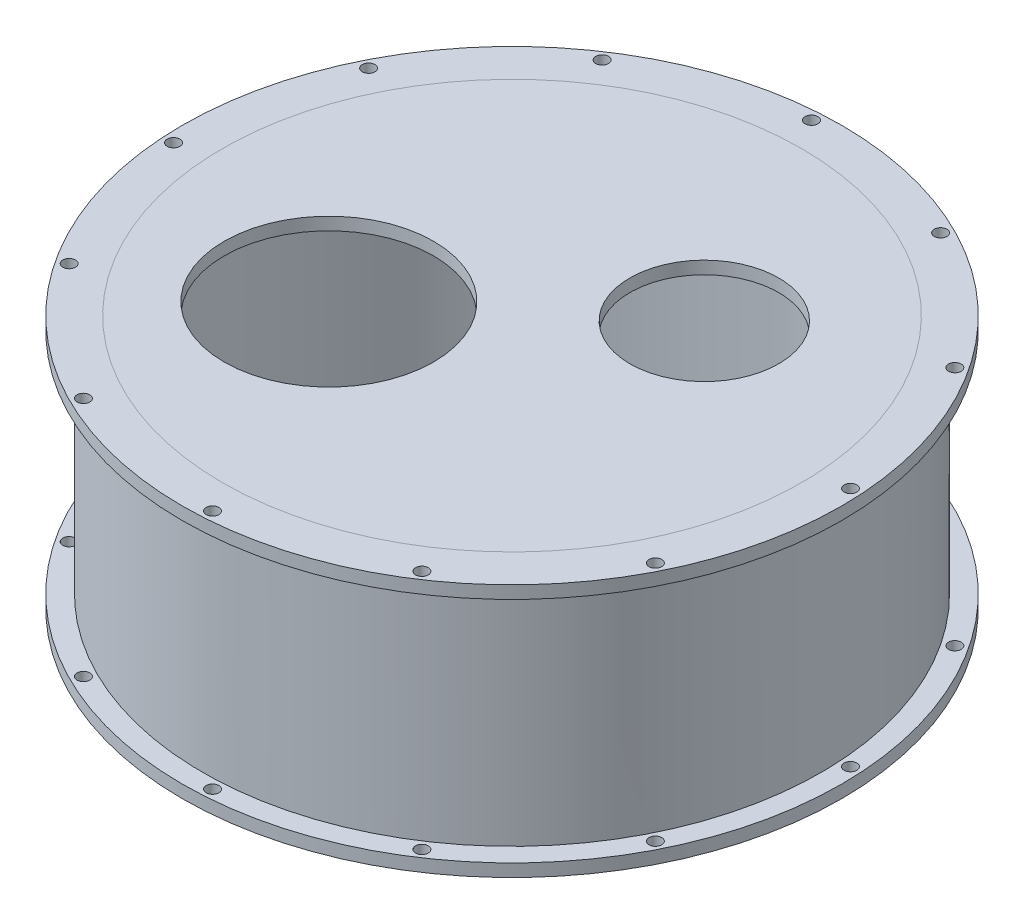
ISO-10303-21;
HEADER;
FILE_DESCRIPTION(('STEP AP214'),'2;1');
FILE_NAME('part.step','',(''),(''),'','','');
FILE_SCHEMA(('AUTOMOTIVE_DESIGN { 1 0 10303 214 1 1 1 1 }'));
ENDSEC;
DATA;
#1=APPLICATION_CONTEXT('core data for automotive mechanical design processes');
#2=APPLICATION_PROTOCOL_DEFINITION('international standard','automotive_design',2000,#1);
#3=PRODUCT_CONTEXT('',#1,'mechanical');
#4=PRODUCT('Part','Part','',(#3));
#5=PRODUCT_RELATED_PRODUCT_CATEGORY('part','',(#4));
#6=PRODUCT_DEFINITION_FORMATION('','',#4);
#7=PRODUCT_DEFINITION_CONTEXT('part definition',#1,'design');
#8=PRODUCT_DEFINITION('design','',#6,#7);
#9=PRODUCT_DEFINITION_SHAPE('','',#8);
#10=(LENGTH_UNIT() NAMED_UNIT(*) SI_UNIT(.MILLI.,.METRE.));
#11=(NAMED_UNIT(*) PLANE_ANGLE_UNIT() SI_UNIT($,.RADIAN.));
#12=(NAMED_UNIT(*) SI_UNIT($,.STERADIAN.) SOLID_ANGLE_UNIT());
#13=UNCERTAINTY_MEASURE_WITH_UNIT(LENGTH_MEASURE(1.E-05),#10,'distance_accuracy_value','');
#14=(GEOMETRIC_REPRESENTATION_CONTEXT(3) GLOBAL_UNCERTAINTY_ASSIGNED_CONTEXT((#13)) GLOBAL_UNIT_ASSIGNED_CONTEXT((#10,
#11,#12)) REPRESENTATION_CONTEXT('',''));
#15=CARTESIAN_POINT('',(0.,0.,0.));
#16=DIRECTION('',(0.,0.,1.));
#17=DIRECTION('',(1.,0.,0.));
#18=AXIS2_PLACEMENT_3D('',#15,#16,#17);
#19=CARTESIAN_POINT('',(0.,120.65,0.));
#20=DIRECTION('',(0.,1.,0.));
#21=DIRECTION('',(0.,0.,1.));
#22=AXIS2_PLACEMENT_3D('',#19,#20,#21);
#23=CYLINDRICAL_SURFACE('',#22,145.);
#24=CARTESIAN_POINT('',(0.,120.65,0.));
#25=DIRECTION('',(0.,1.,0.));
#26=DIRECTION('',(0.,0.,1.));
#27=AXIS2_PLACEMENT_3D('',#24,#25,#26);
#28=CIRCLE('',#27,145.);
#29=CARTESIAN_POINT('',(0.,120.65,145.));
#30=VERTEX_POINT('',#29);
#31=EDGE_CURVE('E12',#30,#30,#28,.T.);
#32=ORIENTED_EDGE('',*,*,#31,.T.);
#33=EDGE_LOOP('',(#32));
#34=FACE_BOUND('',#33,.T.);
#35=CARTESIAN_POINT('',(0.,127.,0.));
#36=DIRECTION('',(0.,1.,0.));
#37=DIRECTION('',(0.,0.,1.));
#38=AXIS2_PLACEMENT_3D('',#35,#36,#37);
#39=CIRCLE('',#38,145.);
#40=CARTESIAN_POINT('',(0.,127.,145.));
#41=VERTEX_POINT('',#40);
#42=EDGE_CURVE('E55',#41,#41,#39,.T.);
#43=ORIENTED_EDGE('',*,*,#42,.F.);
#44=EDGE_LOOP('',(#43));
#45=FACE_BOUND('',#44,.T.);
#46=ADVANCED_FACE('F52',(#34,#45),#23,.T.);
#47=CARTESIAN_POINT('',(0.,120.65,0.));
#48=DIRECTION('',(0.,1.,0.));
#49=DIRECTION('',(0.,0.,1.));
#50=AXIS2_PLACEMENT_3D('',#47,#48,#49);
#51=PLANE('',#50);
#52=CARTESIAN_POINT('',(50.4368162682525,120.65,-45.8953111450811));
#53=DIRECTION('',(0.,1.,0.));
#54=DIRECTION('',(0.,0.,1.));
#55=AXIS2_PLACEMENT_3D('',#52,#53,#54);
#56=CIRCLE('',#55,37.2774260733927);
#57=CARTESIAN_POINT('',(50.4368162682525,120.65,-8.61788507168831));
#58=VERTEX_POINT('',#57);
#59=EDGE_CURVE('E67',#58,#58,#56,.T.);
#60=ORIENTED_EDGE('',*,*,#59,.T.);
#61=EDGE_LOOP('',(#60));
#62=FACE_BOUND('',#61,.T.);
#63=CARTESIAN_POINT('',(-51.935843858665,120.65,39.8005395924841));
#64=DIRECTION('',(0.,1.,0.));
#65=DIRECTION('',(0.,0.,1.));
#66=AXIS2_PLACEMENT_3D('',#63,#64,#65);
#67=CIRCLE('',#66,52.4437447053349);
#68=CARTESIAN_POINT('',(-51.935843858665,120.65,92.244284297819));
#69=VERTEX_POINT('',#68);
#70=EDGE_CURVE('E62',#69,#69,#67,.T.);
#71=ORIENTED_EDGE('',*,*,#70,.T.);
#72=EDGE_LOOP('',(#71));
#73=FACE_BOUND('',#72,.T.);
#74=ORIENTED_EDGE('',*,*,#31,.F.);
#75=EDGE_LOOP('',(#74));
#76=FACE_BOUND('',#75,.T.);
#77=ADVANCED_FACE('F76',(#62,#73,#76),#51,.F.);
#78=CARTESIAN_POINT('',(0.,127.,0.));
#79=DIRECTION('',(0.,1.,0.));
#80=DIRECTION('',(0.,0.,1.));
#81=AXIS2_PLACEMENT_3D('',#78,#79,#80);
#82=PLANE('',#81);
#83=CARTESIAN_POINT('',(50.4368162682525,127.,-45.8953111450811));
#84=DIRECTION('',(0.,1.,0.));
#85=DIRECTION('',(0.,0.,1.));
#86=AXIS2_PLACEMENT_3D('',#83,#84,#85);
#87=CIRCLE('',#86,37.2774260733927);
#88=CARTESIAN_POINT('',(50.4368162682525,127.,-8.61788507168831));
#89=VERTEX_POINT('',#88);
#90=EDGE_CURVE('E70',#89,#89,#87,.T.);
#91=ORIENTED_EDGE('',*,*,#90,.F.);
#92=EDGE_LOOP('',(#91));
#93=FACE_BOUND('',#92,.T.);
#94=CARTESIAN_POINT('',(-51.935843858665,127.,39.8005395924841));
#95=DIRECTION('',(0.,1.,0.));
#96=DIRECTION('',(0.,0.,1.));
#97=AXIS2_PLACEMENT_3D('',#94,#95,#96);
#98=CIRCLE('',#97,52.4437447053349);
#99=CARTESIAN_POINT('',(-51.935843858665,127.,92.244284297819));
#100=VERTEX_POINT('',#99);
#101=EDGE_CURVE('E64',#100,#100,#98,.T.);
#102=ORIENTED_EDGE('',*,*,#101,.F.);
#103=EDGE_LOOP('',(#102));
#104=FACE_BOUND('',#103,.T.);
#105=ORIENTED_EDGE('',*,*,#42,.T.);
#106=EDGE_LOOP('',(#105));
#107=FACE_BOUND('',#106,.T.);
#108=ADVANCED_FACE('F86',(#93,#104,#107),#82,.T.);
#109=CARTESIAN_POINT('',(-51.935843858665,120.65,39.8005395924841));
#110=DIRECTION('',(0.,1.,0.));
#111=DIRECTION('',(0.,0.,1.));
#112=AXIS2_PLACEMENT_3D('',#109,#110,#111);
#113=CYLINDRICAL_SURFACE('',#112,52.4437447053349);
#114=ORIENTED_EDGE('',*,*,#70,.F.);
#115=EDGE_LOOP('',(#114));
#116=FACE_BOUND('',#115,.T.);
#117=ORIENTED_EDGE('',*,*,#101,.T.);
#118=EDGE_LOOP('',(#117));
#119=FACE_BOUND('',#118,.T.);
#120=ADVANCED_FACE('F82',(#116,#119),#113,.F.);
#121=CARTESIAN_POINT('',(50.4368162682525,120.65,-45.8953111450811));
#122=DIRECTION('',(0.,1.,0.));
#123=DIRECTION('',(0.,0.,1.));
#124=AXIS2_PLACEMENT_3D('',#121,#122,#123);
#125=CYLINDRICAL_SURFACE('',#124,37.2774260733927);
#126=ORIENTED_EDGE('',*,*,#59,.F.);
#127=EDGE_LOOP('',(#126));
#128=FACE_BOUND('',#127,.T.);
#129=ORIENTED_EDGE('',*,*,#90,.T.);
#130=EDGE_LOOP('',(#129));
#131=FACE_BOUND('',#130,.T.);
#132=ADVANCED_FACE('F79',(#128,#131),#125,.F.);
#133=CLOSED_SHELL('',(#46,#77,#108,#120,#132));
#134=MANIFOLD_SOLID_BREP('B2',#133);
#135=CARTESIAN_POINT('',(0.,63.5,0.));
#136=DIRECTION('',(0.,-1.,0.));
#137=DIRECTION('',(0.,0.,-1.));
#138=AXIS2_PLACEMENT_3D('',#135,#136,#137);
#139=CYLINDRICAL_SURFACE('',#138,155.);
#140=CARTESIAN_POINT('',(0.,6.35,0.));
#141=DIRECTION('',(0.,-1.,0.));
#142=DIRECTION('',(0.,0.,-1.));
#143=AXIS2_PLACEMENT_3D('',#140,#141,#142);
#144=CIRCLE('',#143,155.);
#145=CARTESIAN_POINT('',(0.,6.35,-155.));
#146=VERTEX_POINT('',#145);
#147=EDGE_CURVE('E140',#146,#146,#144,.T.);
#148=ORIENTED_EDGE('',*,*,#147,.F.);
#149=EDGE_LOOP('',(#148));
#150=FACE_BOUND('',#149,.T.);
#151=CARTESIAN_POINT('',(0.,120.65,0.));
#152=DIRECTION('',(0.,1.,0.));
#153=DIRECTION('',(0.,0.,1.));
#154=AXIS2_PLACEMENT_3D('',#151,#152,#153);
#155=CIRCLE('',#154,155.);
#156=CARTESIAN_POINT('',(0.,120.65,155.));
#157=VERTEX_POINT('',#156);
#158=EDGE_CURVE('E51',#157,#157,#155,.T.);
#159=ORIENTED_EDGE('',*,*,#158,.F.);
#160=EDGE_LOOP('',(#159));
#161=FACE_BOUND('',#160,.T.);
#162=ADVANCED_FACE('F134',(#150,#161),#139,.T.);
#163=CARTESIAN_POINT('',(0.,0.,0.));
#164=DIRECTION('',(0.,1.,0.));
#165=DIRECTION('',(0.,0.,1.));
#166=AXIS2_PLACEMENT_3D('',#163,#164,#165);
#167=PLANE('',#166);
#168=CARTESIAN_POINT('',(-71.4323278955685,0.,143.258608577007));
#169=DIRECTION('',(0.,1.,0.));
#170=DIRECTION('',(-0.499999999999989,0.,0.866025403784445));
#171=AXIS2_PLACEMENT_3D('',#168,#169,#170);
#172=CIRCLE('',#171,3.17499999999999);
#173=CARTESIAN_POINT('',(-73.0198278955684,0.,146.008239234022));
#174=VERTEX_POINT('',#173);
#175=EDGE_CURVE('E184',#174,#174,#172,.T.);
#176=ORIENTED_EDGE('',*,*,#175,.T.);
#177=EDGE_LOOP('',(#176));
#178=FACE_BOUND('',#177,.T.);
#179=CARTESIAN_POINT('',(-133.491514897525,0.,88.3494303907146));
#180=DIRECTION('',(0.,1.,0.));
#181=DIRECTION('',(-0.866025403784433,0.,0.50000000000001));
#182=AXIS2_PLACEMENT_3D('',#179,#180,#181);
#183=CIRCLE('',#182,3.17499999999999);
#184=CARTESIAN_POINT('',(-136.241145554541,0.,89.9369303907146));
#185=VERTEX_POINT('',#184);
#186=EDGE_CURVE('E192',#185,#185,#183,.T.);
#187=ORIENTED_EDGE('',*,*,#186,.T.);
#188=EDGE_LOOP('',(#187));
#189=FACE_BOUND('',#188,.T.);
#190=CARTESIAN_POINT('',(-159.781758286283,0.,9.76709367948083));
#191=DIRECTION('',(0.,1.,0.));
#192=DIRECTION('',(-1.,0.,0.));
#193=AXIS2_PLACEMENT_3D('',#190,#191,#192);
#194=CIRCLE('',#193,3.17499999999999);
#195=CARTESIAN_POINT('',(-162.956758286283,0.,9.76709367948086));
#196=VERTEX_POINT('',#195);
#197=EDGE_CURVE('E198',#196,#196,#194,.T.);
#198=ORIENTED_EDGE('',*,*,#197,.T.);
#199=EDGE_LOOP('',(#198));
#200=FACE_BOUND('',#199,.T.);
#201=CARTESIAN_POINT('',(-143.258608577006,0.,-71.432327895569));
#202=DIRECTION('',(0.,1.,0.));
#203=DIRECTION('',(-0.866025403784443,0.,-0.499999999999992));
#204=AXIS2_PLACEMENT_3D('',#201,#202,#203);
#205=CIRCLE('',#204,3.17499999999999);
#206=CARTESIAN_POINT('',(-146.008239234022,0.,-73.0198278955689));
#207=VERTEX_POINT('',#206);
#208=EDGE_CURVE('E204',#207,#207,#205,.T.);
#209=ORIENTED_EDGE('',*,*,#208,.T.);
#210=EDGE_LOOP('',(#209));
#211=FACE_BOUND('',#210,.T.);
#212=CARTESIAN_POINT('',(-88.3494303907141,0.,-133.491514897526));
#213=DIRECTION('',(0.,1.,0.));
#214=DIRECTION('',(-0.500000000000007,0.,-0.866025403784435));
#215=AXIS2_PLACEMENT_3D('',#212,#213,#214);
#216=CIRCLE('',#215,3.17499999999999);
#217=CARTESIAN_POINT('',(-89.9369303907142,0.,-136.241145554541));
#218=VERTEX_POINT('',#217);
#219=EDGE_CURVE('E210',#218,#218,#216,.T.);
#220=ORIENTED_EDGE('',*,*,#219,.T.);
#221=EDGE_LOOP('',(#220));
#222=FACE_BOUND('',#221,.T.);
#223=CARTESIAN_POINT('',(-9.76709367947915,0.,-159.781758286283));
#224=DIRECTION('',(0.,1.,0.));
#225=DIRECTION('',(0.,0.,-1.));
#226=AXIS2_PLACEMENT_3D('',#223,#224,#225);
#227=CIRCLE('',#226,3.17499999999999);
#228=CARTESIAN_POINT('',(-9.76709367947915,0.,-162.956758286283));
#229=VERTEX_POINT('',#228);
#230=EDGE_CURVE('E216',#229,#229,#227,.T.);
#231=ORIENTED_EDGE('',*,*,#230,.T.);
#232=EDGE_LOOP('',(#231));
#233=FACE_BOUND('',#232,.T.);
#234=CARTESIAN_POINT('',(71.4323278955695,0.,-143.258608577006));
#235=DIRECTION('',(0.,1.,0.));
#236=DIRECTION('',(0.499999999999995,0.,-0.866025403784442));
#237=AXIS2_PLACEMENT_3D('',#234,#235,#236);
#238=CIRCLE('',#237,3.17499999999999);
#239=CARTESIAN_POINT('',(73.0198278955694,0.,-146.008239234022));
#240=VERTEX_POINT('',#239);
#241=EDGE_CURVE('E222',#240,#240,#238,.T.);
#242=ORIENTED_EDGE('',*,*,#241,.T.);
#243=EDGE_LOOP('',(#242));
#244=FACE_BOUND('',#243,.T.);
#245=CARTESIAN_POINT('',(133.491514897526,0.,-88.3494303907137));
#246=DIRECTION('',(0.,1.,0.));
#247=DIRECTION('',(0.866025403784436,0.,-0.500000000000004));
#248=AXIS2_PLACEMENT_3D('',#245,#246,#247);
#249=CIRCLE('',#248,3.17499999999999);
#250=CARTESIAN_POINT('',(136.241145554542,0.,-89.9369303907137));
#251=VERTEX_POINT('',#250);
#252=EDGE_CURVE('E228',#251,#251,#249,.T.);
#253=ORIENTED_EDGE('',*,*,#252,.T.);
#254=EDGE_LOOP('',(#253));
#255=FACE_BOUND('',#254,.T.);
#256=CARTESIAN_POINT('',(159.781758286283,0.,-9.76709367947971));
#257=DIRECTION('',(0.,1.,0.));
#258=DIRECTION('',(1.,0.,0.));
#259=AXIS2_PLACEMENT_3D('',#256,#257,#258);
#260=CIRCLE('',#259,3.17499999999999);
#261=CARTESIAN_POINT('',(162.956758286283,0.,-9.76709367947972));
#262=VERTEX_POINT('',#261);
#263=EDGE_CURVE('E234',#262,#262,#260,.T.);
#264=ORIENTED_EDGE('',*,*,#263,.T.);
#265=EDGE_LOOP('',(#264));
#266=FACE_BOUND('',#265,.T.);
#267=CARTESIAN_POINT('',(143.258608577006,0.,71.43232789557));
#268=DIRECTION('',(0.,1.,0.));
#269=DIRECTION('',(0.86602540378444,0.,0.499999999999998));
#270=AXIS2_PLACEMENT_3D('',#267,#268,#269);
#271=CIRCLE('',#270,3.17499999999999);
#272=CARTESIAN_POINT('',(146.008239234021,0.,73.0198278955699));
#273=VERTEX_POINT('',#272);
#274=EDGE_CURVE('E183',#273,#273,#271,.T.);
#275=ORIENTED_EDGE('',*,*,#274,.T.);
#276=EDGE_LOOP('',(#275));
#277=FACE_BOUND('',#276,.T.);
#278=CARTESIAN_POINT('',(88.3494303907132,0.,133.491514897526));
#279=DIRECTION('',(0.,1.,0.));
#280=DIRECTION('',(0.500000000000001,0.,0.866025403784438));
#281=AXIS2_PLACEMENT_3D('',#278,#279,#280);
#282=CIRCLE('',#281,3.17499999999999);
#283=CARTESIAN_POINT('',(89.9369303907132,0.,136.241145554542));
#284=VERTEX_POINT('',#283);
#285=EDGE_CURVE('E177',#284,#284,#282,.T.);
#286=ORIENTED_EDGE('',*,*,#285,.T.);
#287=EDGE_LOOP('',(#286));
#288=FACE_BOUND('',#287,.T.);
#289=CARTESIAN_POINT('',(9.76709367947915,0.,159.781758286283));
#290=DIRECTION('',(0.,1.,0.));
#291=DIRECTION('',(0.,0.,1.));
#292=AXIS2_PLACEMENT_3D('',#289,#290,#291);
#293=CIRCLE('',#292,3.17499999999999);
#294=CARTESIAN_POINT('',(9.76709367947915,0.,162.956758286283));
#295=VERTEX_POINT('',#294);
#296=EDGE_CURVE('E171',#295,#295,#293,.T.);
#297=ORIENTED_EDGE('',*,*,#296,.T.);
#298=EDGE_LOOP('',(#297));
#299=FACE_BOUND('',#298,.T.);
#300=CARTESIAN_POINT('',(0.,0.,0.));
#301=DIRECTION('',(0.,1.,0.));
#302=DIRECTION('',(0.,0.,1.));
#303=AXIS2_PLACEMENT_3D('',#300,#301,#302);
#304=CIRCLE('',#303,145.);
#305=CARTESIAN_POINT('',(0.,0.,145.));
#306=VERTEX_POINT('',#305);
#307=EDGE_CURVE('E144',#306,#306,#304,.T.);
#308=ORIENTED_EDGE('',*,*,#307,.T.);
#309=EDGE_LOOP('',(#308));
#310=FACE_BOUND('',#309,.T.);
#311=CARTESIAN_POINT('',(0.,0.,0.));
#312=DIRECTION('',(0.,-1.,0.));
#313=DIRECTION('',(0.,0.,-1.));
#314=AXIS2_PLACEMENT_3D('',#311,#312,#313);
#315=CIRCLE('',#314,165.16);
#316=CARTESIAN_POINT('',(0.,0.,-165.16));
#317=VERTEX_POINT('',#316);
#318=EDGE_CURVE('E151',#317,#317,#315,.T.);
#319=ORIENTED_EDGE('',*,*,#318,.T.);
#320=EDGE_LOOP('',(#319));
#321=FACE_BOUND('',#320,.T.);
#322=ADVANCED_FACE('F351',(#178,#189,#200,#211,#222,#233,#244,#255,#266,#277,#288,#299,#310,
#321),#167,.F.);
#323=CARTESIAN_POINT('',(0.,63.5,0.));
#324=DIRECTION('',(0.,-1.,0.));
#325=DIRECTION('',(0.,0.,-1.));
#326=AXIS2_PLACEMENT_3D('',#323,#324,#325);
#327=CYLINDRICAL_SURFACE('',#326,145.);
#328=ORIENTED_EDGE('',*,*,#307,.F.);
#329=EDGE_LOOP('',(#328));
#330=FACE_BOUND('',#329,.T.);
#331=CARTESIAN_POINT('',(0.,127.,0.));
#332=DIRECTION('',(0.,1.,0.));
#333=DIRECTION('',(0.,0.,1.));
#334=AXIS2_PLACEMENT_3D('',#331,#332,#333);
#335=CIRCLE('',#334,145.);
#336=CARTESIAN_POINT('',(0.,127.,145.));
#337=VERTEX_POINT('',#336);
#338=EDGE_CURVE('E154',#337,#337,#335,.T.);
#339=ORIENTED_EDGE('',*,*,#338,.T.);
#340=EDGE_LOOP('',(#339));
#341=FACE_BOUND('',#340,.T.);
#342=ADVANCED_FACE('F356',(#330,#341),#327,.F.);
#343=CARTESIAN_POINT('',(0.,6.35,0.));
#344=DIRECTION('',(0.,-1.,0.));
#345=DIRECTION('',(0.,0.,-1.));
#346=AXIS2_PLACEMENT_3D('',#343,#344,#345);
#347=CYLINDRICAL_SURFACE('',#346,165.16);
#348=CARTESIAN_POINT('',(0.,6.35,0.));
#349=DIRECTION('',(0.,-1.,0.));
#350=DIRECTION('',(0.,0.,-1.));
#351=AXIS2_PLACEMENT_3D('',#348,#349,#350);
#352=CIRCLE('',#351,165.16);
#353=CARTESIAN_POINT('',(0.,6.35,-165.16));
#354=VERTEX_POINT('',#353);
#355=EDGE_CURVE('E148',#354,#354,#352,.T.);
#356=ORIENTED_EDGE('',*,*,#355,.T.);
#357=EDGE_LOOP('',(#356));
#358=FACE_BOUND('',#357,.T.);
#359=ORIENTED_EDGE('',*,*,#318,.F.);
#360=EDGE_LOOP('',(#359));
#361=FACE_BOUND('',#360,.T.);
#362=ADVANCED_FACE('F362',(#358,#361),#347,.T.);
#363=CARTESIAN_POINT('',(0.,6.35,0.));
#364=DIRECTION('',(0.,-1.,0.));
#365=DIRECTION('',(0.,0.,-1.));
#366=AXIS2_PLACEMENT_3D('',#363,#364,#365);
#367=PLANE('',#366);
#368=CARTESIAN_POINT('',(-71.4323278955685,6.34999999999999,143.258608577007));
#369=DIRECTION('',(0.,1.,0.));
#370=DIRECTION('',(-0.499999999999989,0.,0.866025403784445));
#371=AXIS2_PLACEMENT_3D('',#368,#369,#370);
#372=CIRCLE('',#371,3.175);
#373=CARTESIAN_POINT('',(-73.0198278955684,6.34999999999999,146.008239234022));
#374=VERTEX_POINT('',#373);
#375=EDGE_CURVE('E188',#374,#374,#372,.T.);
#376=ORIENTED_EDGE('',*,*,#375,.F.);
#377=EDGE_LOOP('',(#376));
#378=FACE_BOUND('',#377,.T.);
#379=CARTESIAN_POINT('',(-133.491514897525,6.34999999999999,88.3494303907146));
#380=DIRECTION('',(0.,1.,0.));
#381=DIRECTION('',(-0.866025403784433,0.,0.50000000000001));
#382=AXIS2_PLACEMENT_3D('',#379,#380,#381);
#383=CIRCLE('',#382,3.175);
#384=CARTESIAN_POINT('',(-136.241145554541,6.34999999999999,89.9369303907146));
#385=VERTEX_POINT('',#384);
#386=EDGE_CURVE('E187',#385,#385,#383,.T.);
#387=ORIENTED_EDGE('',*,*,#386,.F.);
#388=EDGE_LOOP('',(#387));
#389=FACE_BOUND('',#388,.T.);
#390=CARTESIAN_POINT('',(-159.781758286283,6.34999999999999,9.76709367948083));
#391=DIRECTION('',(0.,1.,0.));
#392=DIRECTION('',(-1.,0.,0.));
#393=AXIS2_PLACEMENT_3D('',#390,#391,#392);
#394=CIRCLE('',#393,3.175);
#395=CARTESIAN_POINT('',(-162.956758286283,6.34999999999999,9.76709367948086));
#396=VERTEX_POINT('',#395);
#397=EDGE_CURVE('E195',#396,#396,#394,.T.);
#398=ORIENTED_EDGE('',*,*,#397,.F.);
#399=EDGE_LOOP('',(#398));
#400=FACE_BOUND('',#399,.T.);
#401=CARTESIAN_POINT('',(-143.258608577006,6.34999999999999,-71.432327895569));
#402=DIRECTION('',(0.,1.,0.));
#403=DIRECTION('',(-0.866025403784443,0.,-0.499999999999992));
#404=AXIS2_PLACEMENT_3D('',#401,#402,#403);
#405=CIRCLE('',#404,3.175);
#406=CARTESIAN_POINT('',(-146.008239234022,6.34999999999999,-73.0198278955689));
#407=VERTEX_POINT('',#406);
#408=EDGE_CURVE('E201',#407,#407,#405,.T.);
#409=ORIENTED_EDGE('',*,*,#408,.F.);
#410=EDGE_LOOP('',(#409));
#411=FACE_BOUND('',#410,.T.);
#412=CARTESIAN_POINT('',(-88.3494303907141,6.34999999999999,-133.491514897526));
#413=DIRECTION('',(0.,1.,0.));
#414=DIRECTION('',(-0.500000000000007,0.,-0.866025403784435));
#415=AXIS2_PLACEMENT_3D('',#412,#413,#414);
#416=CIRCLE('',#415,3.175);
#417=CARTESIAN_POINT('',(-89.9369303907142,6.34999999999999,-136.241145554541));
#418=VERTEX_POINT('',#417);
#419=EDGE_CURVE('E207',#418,#418,#416,.T.);
#420=ORIENTED_EDGE('',*,*,#419,.F.);
#421=EDGE_LOOP('',(#420));
#422=FACE_BOUND('',#421,.T.);
#423=CARTESIAN_POINT('',(-9.76709367947915,6.34999999999999,-159.781758286283));
#424=DIRECTION('',(0.,1.,0.));
#425=DIRECTION('',(0.,0.,-1.));
#426=AXIS2_PLACEMENT_3D('',#423,#424,#425);
#427=CIRCLE('',#426,3.175);
#428=CARTESIAN_POINT('',(-9.76709367947915,6.34999999999999,-162.956758286283));
#429=VERTEX_POINT('',#428);
#430=EDGE_CURVE('E213',#429,#429,#427,.T.);
#431=ORIENTED_EDGE('',*,*,#430,.F.);
#432=EDGE_LOOP('',(#431));
#433=FACE_BOUND('',#432,.T.);
#434=CARTESIAN_POINT('',(71.4323278955695,6.34999999999999,-143.258608577006));
#435=DIRECTION('',(0.,1.,0.));
#436=DIRECTION('',(0.499999999999995,0.,-0.866025403784442));
#437=AXIS2_PLACEMENT_3D('',#434,#435,#436);
#438=CIRCLE('',#437,3.175);
#439=CARTESIAN_POINT('',(73.0198278955694,6.34999999999999,-146.008239234022));
#440=VERTEX_POINT('',#439);
#441=EDGE_CURVE('E219',#440,#440,#438,.T.);
#442=ORIENTED_EDGE('',*,*,#441,.F.);
#443=EDGE_LOOP('',(#442));
#444=FACE_BOUND('',#443,.T.);
#445=CARTESIAN_POINT('',(133.491514897526,6.34999999999999,-88.3494303907137));
#446=DIRECTION('',(0.,1.,0.));
#447=DIRECTION('',(0.866025403784436,0.,-0.500000000000004));
#448=AXIS2_PLACEMENT_3D('',#445,#446,#447);
#449=CIRCLE('',#448,3.175);
#450=CARTESIAN_POINT('',(136.241145554542,6.34999999999999,-89.9369303907137));
#451=VERTEX_POINT('',#450);
#452=EDGE_CURVE('E225',#451,#451,#449,.T.);
#453=ORIENTED_EDGE('',*,*,#452,.F.);
#454=EDGE_LOOP('',(#453));
#455=FACE_BOUND('',#454,.T.);
#456=CARTESIAN_POINT('',(159.781758286283,6.34999999999999,-9.76709367947971));
#457=DIRECTION('',(0.,1.,0.));
#458=DIRECTION('',(1.,0.,0.));
#459=AXIS2_PLACEMENT_3D('',#456,#457,#458);
#460=CIRCLE('',#459,3.175);
#461=CARTESIAN_POINT('',(162.956758286283,6.34999999999999,-9.76709367947972));
#462=VERTEX_POINT('',#461);
#463=EDGE_CURVE('E231',#462,#462,#460,.T.);
#464=ORIENTED_EDGE('',*,*,#463,.F.);
#465=EDGE_LOOP('',(#464));
#466=FACE_BOUND('',#465,.T.);
#467=CARTESIAN_POINT('',(143.258608577006,6.34999999999999,71.43232789557));
#468=DIRECTION('',(0.,1.,0.));
#469=DIRECTION('',(0.86602540378444,0.,0.499999999999998));
#470=AXIS2_PLACEMENT_3D('',#467,#468,#469);
#471=CIRCLE('',#470,3.175);
#472=CARTESIAN_POINT('',(146.008239234021,6.34999999999999,73.0198278955699));
#473=VERTEX_POINT('',#472);
#474=EDGE_CURVE('E237',#473,#473,#471,.T.);
#475=ORIENTED_EDGE('',*,*,#474,.F.);
#476=EDGE_LOOP('',(#475));
#477=FACE_BOUND('',#476,.T.);
#478=CARTESIAN_POINT('',(88.3494303907132,6.34999999999999,133.491514897526));
#479=DIRECTION('',(0.,1.,0.));
#480=DIRECTION('',(0.500000000000001,0.,0.866025403784438));
#481=AXIS2_PLACEMENT_3D('',#478,#479,#480);
#482=CIRCLE('',#481,3.175);
#483=CARTESIAN_POINT('',(89.9369303907132,6.34999999999999,136.241145554542));
#484=VERTEX_POINT('',#483);
#485=EDGE_CURVE('E180',#484,#484,#482,.T.);
#486=ORIENTED_EDGE('',*,*,#485,.F.);
#487=EDGE_LOOP('',(#486));
#488=FACE_BOUND('',#487,.T.);
#489=CARTESIAN_POINT('',(9.76709367947915,6.34999999999999,159.781758286283));
#490=DIRECTION('',(0.,1.,0.));
#491=DIRECTION('',(0.,0.,1.));
#492=AXIS2_PLACEMENT_3D('',#489,#490,#491);
#493=CIRCLE('',#492,3.175);
#494=CARTESIAN_POINT('',(9.76709367947915,6.34999999999999,162.956758286283));
#495=VERTEX_POINT('',#494);
#496=EDGE_CURVE('E174',#495,#495,#493,.T.);
#497=ORIENTED_EDGE('',*,*,#496,.F.);
#498=EDGE_LOOP('',(#497));
#499=FACE_BOUND('',#498,.T.);
#500=ORIENTED_EDGE('',*,*,#147,.T.);
#501=EDGE_LOOP('',(#500));
#502=FACE_BOUND('',#501,.T.);
#503=ORIENTED_EDGE('',*,*,#355,.F.);
#504=EDGE_LOOP('',(#503));
#505=FACE_BOUND('',#504,.T.);
#506=ADVANCED_FACE('F324',(#378,#389,#400,#411,#422,#433,#444,#455,#466,#477,#488,#499,#502,
#505),#367,.F.);
#507=CARTESIAN_POINT('',(0.,127.,0.));
#508=DIRECTION('',(0.,-1.,0.));
#509=DIRECTION('',(0.,0.,1.));
#510=AXIS2_PLACEMENT_3D('',#507,#508,#509);
#511=PLANE('',#510);
#512=CARTESIAN_POINT('',(-71.4323278955685,127.,143.258608577007));
#513=DIRECTION('',(0.,1.,0.));
#514=DIRECTION('',(-0.499999999999989,0.,0.866025403784445));
#515=AXIS2_PLACEMENT_3D('',#512,#513,#514);
#516=CIRCLE('',#515,3.17499999999999);
#517=CARTESIAN_POINT('',(-73.0198278955684,127.,146.008239234022));
#518=VERTEX_POINT('',#517);
#519=EDGE_CURVE('E250',#518,#518,#516,.T.);
#520=ORIENTED_EDGE('',*,*,#519,.F.);
#521=EDGE_LOOP('',(#520));
#522=FACE_BOUND('',#521,.T.);
#523=CARTESIAN_POINT('',(-133.491514897525,127.,88.3494303907146));
#524=DIRECTION('',(0.,1.,0.));
#525=DIRECTION('',(-0.866025403784433,0.,0.50000000000001));
#526=AXIS2_PLACEMENT_3D('',#523,#524,#525);
#527=CIRCLE('',#526,3.17499999999999);
#528=CARTESIAN_POINT('',(-136.241145554541,127.,89.9369303907146));
#529=VERTEX_POINT('',#528);
#530=EDGE_CURVE('E257',#529,#529,#527,.T.);
#531=ORIENTED_EDGE('',*,*,#530,.F.);
#532=EDGE_LOOP('',(#531));
#533=FACE_BOUND('',#532,.T.);
#534=CARTESIAN_POINT('',(-159.781758286283,127.,9.76709367948083));
#535=DIRECTION('',(0.,1.,0.));
#536=DIRECTION('',(-1.,0.,0.));
#537=AXIS2_PLACEMENT_3D('',#534,#535,#536);
#538=CIRCLE('',#537,3.17499999999999);
#539=CARTESIAN_POINT('',(-162.956758286283,127.,9.76709367948086));
#540=VERTEX_POINT('',#539);
#541=EDGE_CURVE('E263',#540,#540,#538,.T.);
#542=ORIENTED_EDGE('',*,*,#541,.F.);
#543=EDGE_LOOP('',(#542));
#544=FACE_BOUND('',#543,.T.);
#545=CARTESIAN_POINT('',(-143.258608577006,127.,-71.432327895569));
#546=DIRECTION('',(0.,1.,0.));
#547=DIRECTION('',(-0.866025403784443,0.,-0.499999999999992));
#548=AXIS2_PLACEMENT_3D('',#545,#546,#547);
#549=CIRCLE('',#548,3.17499999999999);
#550=CARTESIAN_POINT('',(-146.008239234022,127.,-73.0198278955689));
#551=VERTEX_POINT('',#550);
#552=EDGE_CURVE('E269',#551,#551,#549,.T.);
#553=ORIENTED_EDGE('',*,*,#552,.F.);
#554=EDGE_LOOP('',(#553));
#555=FACE_BOUND('',#554,.T.);
#556=CARTESIAN_POINT('',(-88.3494303907141,127.,-133.491514897526));
#557=DIRECTION('',(0.,1.,0.));
#558=DIRECTION('',(-0.500000000000007,0.,-0.866025403784435));
#559=AXIS2_PLACEMENT_3D('',#556,#557,#558);
#560=CIRCLE('',#559,3.17499999999999);
#561=CARTESIAN_POINT('',(-89.9369303907142,127.,-136.241145554541));
#562=VERTEX_POINT('',#561);
#563=EDGE_CURVE('E275',#562,#562,#560,.T.);
#564=ORIENTED_EDGE('',*,*,#563,.F.);
#565=EDGE_LOOP('',(#564));
#566=FACE_BOUND('',#565,.T.);
#567=CARTESIAN_POINT('',(-9.76709367947915,127.,-159.781758286283));
#568=DIRECTION('',(0.,1.,0.));
#569=DIRECTION('',(0.,0.,-1.));
#570=AXIS2_PLACEMENT_3D('',#567,#568,#569);
#571=CIRCLE('',#570,3.17499999999999);
#572=CARTESIAN_POINT('',(-9.76709367947915,127.,-162.956758286283));
#573=VERTEX_POINT('',#572);
#574=EDGE_CURVE('E281',#573,#573,#571,.T.);
#575=ORIENTED_EDGE('',*,*,#574,.F.);
#576=EDGE_LOOP('',(#575));
#577=FACE_BOUND('',#576,.T.);
#578=CARTESIAN_POINT('',(71.4323278955695,127.,-143.258608577006));
#579=DIRECTION('',(0.,1.,0.));
#580=DIRECTION('',(0.499999999999995,0.,-0.866025403784442));
#581=AXIS2_PLACEMENT_3D('',#578,#579,#580);
#582=CIRCLE('',#581,3.17499999999999);
#583=CARTESIAN_POINT('',(73.0198278955694,127.,-146.008239234022));
#584=VERTEX_POINT('',#583);
#585=EDGE_CURVE('E287',#584,#584,#582,.T.);
#586=ORIENTED_EDGE('',*,*,#585,.F.);
#587=EDGE_LOOP('',(#586));
#588=FACE_BOUND('',#587,.T.);
#589=CARTESIAN_POINT('',(133.491514897526,127.,-88.3494303907137));
#590=DIRECTION('',(0.,1.,0.));
#591=DIRECTION('',(0.866025403784436,0.,-0.500000000000004));
#592=AXIS2_PLACEMENT_3D('',#589,#590,#591);
#593=CIRCLE('',#592,3.17499999999999);
#594=CARTESIAN_POINT('',(136.241145554542,127.,-89.9369303907137));
#595=VERTEX_POINT('',#594);
#596=EDGE_CURVE('E293',#595,#595,#593,.T.);
#597=ORIENTED_EDGE('',*,*,#596,.F.);
#598=EDGE_LOOP('',(#597));
#599=FACE_BOUND('',#598,.T.);
#600=CARTESIAN_POINT('',(159.781758286283,127.,-9.76709367947971));
#601=DIRECTION('',(0.,1.,0.));
#602=DIRECTION('',(1.,0.,0.));
#603=AXIS2_PLACEMENT_3D('',#600,#601,#602);
#604=CIRCLE('',#603,3.17499999999999);
#605=CARTESIAN_POINT('',(162.956758286283,127.,-9.76709367947972));
#606=VERTEX_POINT('',#605);
#607=EDGE_CURVE('E299',#606,#606,#604,.T.);
#608=ORIENTED_EDGE('',*,*,#607,.F.);
#609=EDGE_LOOP('',(#608));
#610=FACE_BOUND('',#609,.T.);
#611=CARTESIAN_POINT('',(143.258608577006,127.,71.43232789557));
#612=DIRECTION('',(0.,1.,0.));
#613=DIRECTION('',(0.86602540378444,0.,0.499999999999998));
#614=AXIS2_PLACEMENT_3D('',#611,#612,#613);
#615=CIRCLE('',#614,3.17499999999999);
#616=CARTESIAN_POINT('',(146.008239234021,127.,73.0198278955699));
#617=VERTEX_POINT('',#616);
#618=EDGE_CURVE('E249',#617,#617,#615,.T.);
#619=ORIENTED_EDGE('',*,*,#618,.F.);
#620=EDGE_LOOP('',(#619));
#621=FACE_BOUND('',#620,.T.);
#622=CARTESIAN_POINT('',(88.3494303907132,127.,133.491514897526));
#623=DIRECTION('',(0.,1.,0.));
#624=DIRECTION('',(0.500000000000001,0.,0.866025403784438));
#625=AXIS2_PLACEMENT_3D('',#622,#623,#624);
#626=CIRCLE('',#625,3.17499999999999);
#627=CARTESIAN_POINT('',(89.9369303907132,127.,136.241145554542));
#628=VERTEX_POINT('',#627);
#629=EDGE_CURVE('E191',#628,#628,#626,.T.);
#630=ORIENTED_EDGE('',*,*,#629,.F.);
#631=EDGE_LOOP('',(#630));
#632=FACE_BOUND('',#631,.T.);
#633=CARTESIAN_POINT('',(9.76709367947915,127.,159.781758286283));
#634=DIRECTION('',(0.,1.,0.));
#635=DIRECTION('',(0.,0.,1.));
#636=AXIS2_PLACEMENT_3D('',#633,#634,#635);
#637=CIRCLE('',#636,3.17499999999999);
#638=CARTESIAN_POINT('',(9.76709367947915,127.,162.956758286283));
#639=VERTEX_POINT('',#638);
#640=EDGE_CURVE('E168',#639,#639,#637,.T.);
#641=ORIENTED_EDGE('',*,*,#640,.F.);
#642=EDGE_LOOP('',(#641));
#643=FACE_BOUND('',#642,.T.);
#644=ORIENTED_EDGE('',*,*,#338,.F.);
#645=EDGE_LOOP('',(#644));
#646=FACE_BOUND('',#645,.T.);
#647=CARTESIAN_POINT('',(0.,127.,0.));
#648=DIRECTION('',(0.,-1.,0.));
#649=DIRECTION('',(0.,0.,-1.));
#650=AXIS2_PLACEMENT_3D('',#647,#648,#649);
#651=CIRCLE('',#650,165.16);
#652=CARTESIAN_POINT('',(0.,127.,-165.16));
#653=VERTEX_POINT('',#652);
#654=EDGE_CURVE('E160',#653,#653,#651,.T.);
#655=ORIENTED_EDGE('',*,*,#654,.F.);
#656=EDGE_LOOP('',(#655));
#657=FACE_BOUND('',#656,.T.);
#658=ADVANCED_FACE('F321',(#522,#533,#544,#555,#566,#577,#588,#599,#610,#621,#632,#643,#646,
#657),#511,.F.);
#659=CARTESIAN_POINT('',(0.,120.65,0.));
#660=DIRECTION('',(0.,1.,0.));
#661=DIRECTION('',(0.,0.,-1.));
#662=AXIS2_PLACEMENT_3D('',#659,#660,#661);
#663=PLANE('',#662);
#664=CARTESIAN_POINT('',(-71.4323278955685,120.65,143.258608577007));
#665=DIRECTION('',(0.,1.,0.));
#666=DIRECTION('',(-0.499999999999989,0.,0.866025403784445));
#667=AXIS2_PLACEMENT_3D('',#664,#665,#666);
#668=CIRCLE('',#667,3.175);
#669=CARTESIAN_POINT('',(-73.0198278955684,120.65,146.008239234022));
#670=VERTEX_POINT('',#669);
#671=EDGE_CURVE('E254',#670,#670,#668,.T.);
#672=ORIENTED_EDGE('',*,*,#671,.T.);
#673=EDGE_LOOP('',(#672));
#674=FACE_BOUND('',#673,.T.);
#675=CARTESIAN_POINT('',(-133.491514897525,120.65,88.3494303907146));
#676=DIRECTION('',(0.,1.,0.));
#677=DIRECTION('',(-0.866025403784433,0.,0.50000000000001));
#678=AXIS2_PLACEMENT_3D('',#675,#676,#677);
#679=CIRCLE('',#678,3.175);
#680=CARTESIAN_POINT('',(-136.241145554541,120.65,89.9369303907146));
#681=VERTEX_POINT('',#680);
#682=EDGE_CURVE('E253',#681,#681,#679,.T.);
#683=ORIENTED_EDGE('',*,*,#682,.T.);
#684=EDGE_LOOP('',(#683));
#685=FACE_BOUND('',#684,.T.);
#686=CARTESIAN_POINT('',(-159.781758286283,120.65,9.76709367948083));
#687=DIRECTION('',(0.,1.,0.));
#688=DIRECTION('',(-1.,0.,0.));
#689=AXIS2_PLACEMENT_3D('',#686,#687,#688);
#690=CIRCLE('',#689,3.175);
#691=CARTESIAN_POINT('',(-162.956758286283,120.65,9.76709367948086));
#692=VERTEX_POINT('',#691);
#693=EDGE_CURVE('E260',#692,#692,#690,.T.);
#694=ORIENTED_EDGE('',*,*,#693,.T.);
#695=EDGE_LOOP('',(#694));
#696=FACE_BOUND('',#695,.T.);
#697=CARTESIAN_POINT('',(-143.258608577006,120.65,-71.432327895569));
#698=DIRECTION('',(0.,1.,0.));
#699=DIRECTION('',(-0.866025403784443,0.,-0.499999999999992));
#700=AXIS2_PLACEMENT_3D('',#697,#698,#699);
#701=CIRCLE('',#700,3.175);
#702=CARTESIAN_POINT('',(-146.008239234022,120.65,-73.0198278955689));
#703=VERTEX_POINT('',#702);
#704=EDGE_CURVE('E266',#703,#703,#701,.T.);
#705=ORIENTED_EDGE('',*,*,#704,.T.);
#706=EDGE_LOOP('',(#705));
#707=FACE_BOUND('',#706,.T.);
#708=CARTESIAN_POINT('',(-88.3494303907141,120.65,-133.491514897526));
#709=DIRECTION('',(0.,1.,0.));
#710=DIRECTION('',(-0.500000000000007,0.,-0.866025403784435));
#711=AXIS2_PLACEMENT_3D('',#708,#709,#710);
#712=CIRCLE('',#711,3.175);
#713=CARTESIAN_POINT('',(-89.9369303907142,120.65,-136.241145554541));
#714=VERTEX_POINT('',#713);
#715=EDGE_CURVE('E272',#714,#714,#712,.T.);
#716=ORIENTED_EDGE('',*,*,#715,.T.);
#717=EDGE_LOOP('',(#716));
#718=FACE_BOUND('',#717,.T.);
#719=CARTESIAN_POINT('',(-9.76709367947915,120.65,-159.781758286283));
#720=DIRECTION('',(0.,1.,0.));
#721=DIRECTION('',(0.,0.,-1.));
#722=AXIS2_PLACEMENT_3D('',#719,#720,#721);
#723=CIRCLE('',#722,3.175);
#724=CARTESIAN_POINT('',(-9.76709367947915,120.65,-162.956758286283));
#725=VERTEX_POINT('',#724);
#726=EDGE_CURVE('E278',#725,#725,#723,.T.);
#727=ORIENTED_EDGE('',*,*,#726,.T.);
#728=EDGE_LOOP('',(#727));
#729=FACE_BOUND('',#728,.T.);
#730=CARTESIAN_POINT('',(71.4323278955695,120.65,-143.258608577006));
#731=DIRECTION('',(0.,1.,0.));
#732=DIRECTION('',(0.499999999999995,0.,-0.866025403784442));
#733=AXIS2_PLACEMENT_3D('',#730,#731,#732);
#734=CIRCLE('',#733,3.175);
#735=CARTESIAN_POINT('',(73.0198278955694,120.65,-146.008239234022));
#736=VERTEX_POINT('',#735);
#737=EDGE_CURVE('E284',#736,#736,#734,.T.);
#738=ORIENTED_EDGE('',*,*,#737,.T.);
#739=EDGE_LOOP('',(#738));
#740=FACE_BOUND('',#739,.T.);
#741=CARTESIAN_POINT('',(133.491514897526,120.65,-88.3494303907137));
#742=DIRECTION('',(0.,1.,0.));
#743=DIRECTION('',(0.866025403784436,0.,-0.500000000000004));
#744=AXIS2_PLACEMENT_3D('',#741,#742,#743);
#745=CIRCLE('',#744,3.175);
#746=CARTESIAN_POINT('',(136.241145554542,120.65,-89.9369303907137));
#747=VERTEX_POINT('',#746);
#748=EDGE_CURVE('E290',#747,#747,#745,.T.);
#749=ORIENTED_EDGE('',*,*,#748,.T.);
#750=EDGE_LOOP('',(#749));
#751=FACE_BOUND('',#750,.T.);
#752=CARTESIAN_POINT('',(159.781758286283,120.65,-9.76709367947971));
#753=DIRECTION('',(0.,1.,0.));
#754=DIRECTION('',(1.,0.,0.));
#755=AXIS2_PLACEMENT_3D('',#752,#753,#754);
#756=CIRCLE('',#755,3.175);
#757=CARTESIAN_POINT('',(162.956758286283,120.65,-9.76709367947972));
#758=VERTEX_POINT('',#757);
#759=EDGE_CURVE('E296',#758,#758,#756,.T.);
#760=ORIENTED_EDGE('',*,*,#759,.T.);
#761=EDGE_LOOP('',(#760));
#762=FACE_BOUND('',#761,.T.);
#763=CARTESIAN_POINT('',(143.258608577006,120.65,71.43232789557));
#764=DIRECTION('',(0.,1.,0.));
#765=DIRECTION('',(0.86602540378444,0.,0.499999999999998));
#766=AXIS2_PLACEMENT_3D('',#763,#764,#765);
#767=CIRCLE('',#766,3.175);
#768=CARTESIAN_POINT('',(146.008239234021,120.65,73.0198278955699));
#769=VERTEX_POINT('',#768);
#770=EDGE_CURVE('E302',#769,#769,#767,.T.);
#771=ORIENTED_EDGE('',*,*,#770,.T.);
#772=EDGE_LOOP('',(#771));
#773=FACE_BOUND('',#772,.T.);
#774=CARTESIAN_POINT('',(88.3494303907132,120.65,133.491514897526));
#775=DIRECTION('',(0.,1.,0.));
#776=DIRECTION('',(0.500000000000001,0.,0.866025403784438));
#777=AXIS2_PLACEMENT_3D('',#774,#775,#776);
#778=CIRCLE('',#777,3.175);
#779=CARTESIAN_POINT('',(89.9369303907132,120.65,136.241145554542));
#780=VERTEX_POINT('',#779);
#781=EDGE_CURVE('E246',#780,#780,#778,.T.);
#782=ORIENTED_EDGE('',*,*,#781,.T.);
#783=EDGE_LOOP('',(#782));
#784=FACE_BOUND('',#783,.T.);
#785=CARTESIAN_POINT('',(9.76709367947915,120.65,159.781758286283));
#786=DIRECTION('',(0.,1.,0.));
#787=DIRECTION('',(0.,0.,1.));
#788=AXIS2_PLACEMENT_3D('',#785,#786,#787);
#789=CIRCLE('',#788,3.175);
#790=CARTESIAN_POINT('',(9.76709367947915,120.65,162.956758286283));
#791=VERTEX_POINT('',#790);
#792=EDGE_CURVE('E163',#791,#791,#789,.T.);
#793=ORIENTED_EDGE('',*,*,#792,.T.);
#794=EDGE_LOOP('',(#793));
#795=FACE_BOUND('',#794,.T.);
#796=CARTESIAN_POINT('',(0.,120.65,0.));
#797=DIRECTION('',(0.,-1.,0.));
#798=DIRECTION('',(0.,0.,-1.));
#799=AXIS2_PLACEMENT_3D('',#796,#797,#798);
#800=CIRCLE('',#799,165.16);
#801=CARTESIAN_POINT('',(0.,120.65,-165.16));
#802=VERTEX_POINT('',#801);
#803=EDGE_CURVE('E159',#802,#802,#800,.T.);
#804=ORIENTED_EDGE('',*,*,#803,.T.);
#805=EDGE_LOOP('',(#804));
#806=FACE_BOUND('',#805,.T.);
#807=ORIENTED_EDGE('',*,*,#158,.T.);
#808=EDGE_LOOP('',(#807));
#809=FACE_BOUND('',#808,.T.);
#810=ADVANCED_FACE('F310',(#674,#685,#696,#707,#718,#729,#740,#751,#762,#773,#784,#795,#806,
#809),#663,.F.);
#811=CARTESIAN_POINT('',(0.,120.65,0.));
#812=DIRECTION('',(0.,1.,0.));
#813=DIRECTION('',(0.,0.,1.));
#814=AXIS2_PLACEMENT_3D('',#811,#812,#813);
#815=CYLINDRICAL_SURFACE('',#814,165.16);
#816=ORIENTED_EDGE('',*,*,#803,.F.);
#817=EDGE_LOOP('',(#816));
#818=FACE_BOUND('',#817,.T.);
#819=ORIENTED_EDGE('',*,*,#654,.T.);
#820=EDGE_LOOP('',(#819));
#821=FACE_BOUND('',#820,.T.);
#822=ADVANCED_FACE('F335',(#818,#821),#815,.T.);
#823=CARTESIAN_POINT('',(9.76709367947915,127.,159.781758286283));
#824=DIRECTION('',(0.,1.,0.));
#825=DIRECTION('',(0.,0.,1.));
#826=AXIS2_PLACEMENT_3D('',#823,#824,#825);
#827=CYLINDRICAL_SURFACE('',#826,3.17499999999999);
#828=ORIENTED_EDGE('',*,*,#792,.F.);
#829=EDGE_LOOP('',(#828));
#830=FACE_BOUND('',#829,.T.);
#831=ORIENTED_EDGE('',*,*,#640,.T.);
#832=EDGE_LOOP('',(#831));
#833=FACE_BOUND('',#832,.T.);
#834=ADVANCED_FACE('F337',(#830,#833),#827,.F.);
#835=CARTESIAN_POINT('',(9.76709367947915,0.,159.781758286283));
#836=DIRECTION('',(0.,-1.,0.));
#837=DIRECTION('',(0.,0.,1.));
#838=AXIS2_PLACEMENT_3D('',#835,#836,#837);
#839=CYLINDRICAL_SURFACE('',#838,3.17499999999999);
#840=ORIENTED_EDGE('',*,*,#496,.T.);
#841=EDGE_LOOP('',(#840));
#842=FACE_BOUND('',#841,.T.);
#843=ORIENTED_EDGE('',*,*,#296,.F.);
#844=EDGE_LOOP('',(#843));
#845=FACE_BOUND('',#844,.T.);
#846=ADVANCED_FACE('F344',(#842,#845),#839,.F.);
#847=CARTESIAN_POINT('',(88.3494303907132,0.,133.491514897526));
#848=DIRECTION('',(0.,-1.,0.));
#849=DIRECTION('',(0.500000000000001,0.,0.866025403784438));
#850=AXIS2_PLACEMENT_3D('',#847,#848,#849);
#851=CYLINDRICAL_SURFACE('',#850,3.17499999999999);
#852=ORIENTED_EDGE('',*,*,#485,.T.);
#853=EDGE_LOOP('',(#852));
#854=FACE_BOUND('',#853,.T.);
#855=ORIENTED_EDGE('',*,*,#285,.F.);
#856=EDGE_LOOP('',(#855));
#857=FACE_BOUND('',#856,.T.);
#858=ADVANCED_FACE('F405',(#854,#857),#851,.F.);
#859=CARTESIAN_POINT('',(143.258608577006,0.,71.43232789557));
#860=DIRECTION('',(0.,-1.,0.));
#861=DIRECTION('',(0.86602540378444,0.,0.499999999999998));
#862=AXIS2_PLACEMENT_3D('',#859,#860,#861);
#863=CYLINDRICAL_SURFACE('',#862,3.17499999999999);
#864=ORIENTED_EDGE('',*,*,#474,.T.);
#865=EDGE_LOOP('',(#864));
#866=FACE_BOUND('',#865,.T.);
#867=ORIENTED_EDGE('',*,*,#274,.F.);
#868=EDGE_LOOP('',(#867));
#869=FACE_BOUND('',#868,.T.);
#870=ADVANCED_FACE('F415',(#866,#869),#863,.F.);
#871=CARTESIAN_POINT('',(159.781758286283,0.,-9.76709367947971));
#872=DIRECTION('',(0.,-1.,0.));
#873=DIRECTION('',(1.,0.,0.));
#874=AXIS2_PLACEMENT_3D('',#871,#872,#873);
#875=CYLINDRICAL_SURFACE('',#874,3.17499999999999);
#876=ORIENTED_EDGE('',*,*,#463,.T.);
#877=EDGE_LOOP('',(#876));
#878=FACE_BOUND('',#877,.T.);
#879=ORIENTED_EDGE('',*,*,#263,.F.);
#880=EDGE_LOOP('',(#879));
#881=FACE_BOUND('',#880,.T.);
#882=ADVANCED_FACE('F450',(#878,#881),#875,.F.);
#883=CARTESIAN_POINT('',(133.491514897526,0.,-88.3494303907137));
#884=DIRECTION('',(0.,-1.,0.));
#885=DIRECTION('',(0.866025403784436,0.,-0.500000000000004));
#886=AXIS2_PLACEMENT_3D('',#883,#884,#885);
#887=CYLINDRICAL_SURFACE('',#886,3.17499999999999);
#888=ORIENTED_EDGE('',*,*,#452,.T.);
#889=EDGE_LOOP('',(#888));
#890=FACE_BOUND('',#889,.T.);
#891=ORIENTED_EDGE('',*,*,#252,.F.);
#892=EDGE_LOOP('',(#891));
#893=FACE_BOUND('',#892,.T.);
#894=ADVANCED_FACE('F446',(#890,#893),#887,.F.);
#895=CARTESIAN_POINT('',(71.4323278955695,0.,-143.258608577006));
#896=DIRECTION('',(0.,-1.,0.));
#897=DIRECTION('',(0.499999999999995,0.,-0.866025403784442));
#898=AXIS2_PLACEMENT_3D('',#895,#896,#897);
#899=CYLINDRICAL_SURFACE('',#898,3.17499999999999);
#900=ORIENTED_EDGE('',*,*,#441,.T.);
#901=EDGE_LOOP('',(#900));
#902=FACE_BOUND('',#901,.T.);
#903=ORIENTED_EDGE('',*,*,#241,.F.);
#904=EDGE_LOOP('',(#903));
#905=FACE_BOUND('',#904,.T.);
#906=ADVANCED_FACE('F442',(#902,#905),#899,.F.);
#907=CARTESIAN_POINT('',(-9.76709367947915,0.,-159.781758286283));
#908=DIRECTION('',(0.,-1.,0.));
#909=DIRECTION('',(0.,0.,-1.));
#910=AXIS2_PLACEMENT_3D('',#907,#908,#909);
#911=CYLINDRICAL_SURFACE('',#910,3.17499999999999);
#912=ORIENTED_EDGE('',*,*,#430,.T.);
#913=EDGE_LOOP('',(#912));
#914=FACE_BOUND('',#913,.T.);
#915=ORIENTED_EDGE('',*,*,#230,.F.);
#916=EDGE_LOOP('',(#915));
#917=FACE_BOUND('',#916,.T.);
#918=ADVANCED_FACE('F438',(#914,#917),#911,.F.);
#919=CARTESIAN_POINT('',(-88.3494303907141,0.,-133.491514897526));
#920=DIRECTION('',(0.,-1.,0.));
#921=DIRECTION('',(-0.500000000000007,0.,-0.866025403784435));
#922=AXIS2_PLACEMENT_3D('',#919,#920,#921);
#923=CYLINDRICAL_SURFACE('',#922,3.17499999999999);
#924=ORIENTED_EDGE('',*,*,#419,.T.);
#925=EDGE_LOOP('',(#924));
#926=FACE_BOUND('',#925,.T.);
#927=ORIENTED_EDGE('',*,*,#219,.F.);
#928=EDGE_LOOP('',(#927));
#929=FACE_BOUND('',#928,.T.);
#930=ADVANCED_FACE('F434',(#926,#929),#923,.F.);
#931=CARTESIAN_POINT('',(-143.258608577006,0.,-71.432327895569));
#932=DIRECTION('',(0.,-1.,0.));
#933=DIRECTION('',(-0.866025403784443,0.,-0.499999999999992));
#934=AXIS2_PLACEMENT_3D('',#931,#932,#933);
#935=CYLINDRICAL_SURFACE('',#934,3.17499999999999);
#936=ORIENTED_EDGE('',*,*,#408,.T.);
#937=EDGE_LOOP('',(#936));
#938=FACE_BOUND('',#937,.T.);
#939=ORIENTED_EDGE('',*,*,#208,.F.);
#940=EDGE_LOOP('',(#939));
#941=FACE_BOUND('',#940,.T.);
#942=ADVANCED_FACE('F430',(#938,#941),#935,.F.);
#943=CARTESIAN_POINT('',(-159.781758286283,0.,9.76709367948083));
#944=DIRECTION('',(0.,-1.,0.));
#945=DIRECTION('',(-1.,0.,0.));
#946=AXIS2_PLACEMENT_3D('',#943,#944,#945);
#947=CYLINDRICAL_SURFACE('',#946,3.17499999999999);
#948=ORIENTED_EDGE('',*,*,#397,.T.);
#949=EDGE_LOOP('',(#948));
#950=FACE_BOUND('',#949,.T.);
#951=ORIENTED_EDGE('',*,*,#197,.F.);
#952=EDGE_LOOP('',(#951));
#953=FACE_BOUND('',#952,.T.);
#954=ADVANCED_FACE('F426',(#950,#953),#947,.F.);
#955=CARTESIAN_POINT('',(-133.491514897525,0.,88.3494303907146));
#956=DIRECTION('',(0.,-1.,0.));
#957=DIRECTION('',(-0.866025403784433,0.,0.50000000000001));
#958=AXIS2_PLACEMENT_3D('',#955,#956,#957);
#959=CYLINDRICAL_SURFACE('',#958,3.17499999999999);
#960=ORIENTED_EDGE('',*,*,#386,.T.);
#961=EDGE_LOOP('',(#960));
#962=FACE_BOUND('',#961,.T.);
#963=ORIENTED_EDGE('',*,*,#186,.F.);
#964=EDGE_LOOP('',(#963));
#965=FACE_BOUND('',#964,.T.);
#966=ADVANCED_FACE('F422',(#962,#965),#959,.F.);
#967=CARTESIAN_POINT('',(-71.4323278955685,0.,143.258608577007));
#968=DIRECTION('',(0.,-1.,0.));
#969=DIRECTION('',(-0.499999999999989,0.,0.866025403784445));
#970=AXIS2_PLACEMENT_3D('',#967,#968,#969);
#971=CYLINDRICAL_SURFACE('',#970,3.17499999999999);
#972=ORIENTED_EDGE('',*,*,#375,.T.);
#973=EDGE_LOOP('',(#972));
#974=FACE_BOUND('',#973,.T.);
#975=ORIENTED_EDGE('',*,*,#175,.F.);
#976=EDGE_LOOP('',(#975));
#977=FACE_BOUND('',#976,.T.);
#978=ADVANCED_FACE('F419',(#974,#977),#971,.F.);
#979=CARTESIAN_POINT('',(88.3494303907132,127.,133.491514897526));
#980=DIRECTION('',(0.,1.,0.));
#981=DIRECTION('',(0.500000000000001,0.,0.866025403784438));
#982=AXIS2_PLACEMENT_3D('',#979,#980,#981);
#983=CYLINDRICAL_SURFACE('',#982,3.17499999999999);
#984=ORIENTED_EDGE('',*,*,#781,.F.);
#985=EDGE_LOOP('',(#984));
#986=FACE_BOUND('',#985,.T.);
#987=ORIENTED_EDGE('',*,*,#629,.T.);
#988=EDGE_LOOP('',(#987));
#989=FACE_BOUND('',#988,.T.);
#990=ADVANCED_FACE('F317',(#986,#989),#983,.F.);
#991=CARTESIAN_POINT('',(143.258608577006,127.,71.43232789557));
#992=DIRECTION('',(0.,1.,0.));
#993=DIRECTION('',(0.86602540378444,0.,0.499999999999998));
#994=AXIS2_PLACEMENT_3D('',#991,#992,#993);
#995=CYLINDRICAL_SURFACE('',#994,3.17499999999999);
#996=ORIENTED_EDGE('',*,*,#770,.F.);
#997=EDGE_LOOP('',(#996));
#998=FACE_BOUND('',#997,.T.);
#999=ORIENTED_EDGE('',*,*,#618,.T.);
#1000=EDGE_LOOP('',(#999));
#1001=FACE_BOUND('',#1000,.T.);
#1002=ADVANCED_FACE('F313',(#998,#1001),#995,.F.);
#1003=CARTESIAN_POINT('',(159.781758286283,127.,-9.76709367947971));
#1004=DIRECTION('',(0.,1.,0.));
#1005=DIRECTION('',(1.,0.,0.));
#1006=AXIS2_PLACEMENT_3D('',#1003,#1004,#1005);
#1007=CYLINDRICAL_SURFACE('',#1006,3.17499999999999);
#1008=ORIENTED_EDGE('',*,*,#759,.F.);
#1009=EDGE_LOOP('',(#1008));
#1010=FACE_BOUND('',#1009,.T.);
#1011=ORIENTED_EDGE('',*,*,#607,.T.);
#1012=EDGE_LOOP('',(#1011));
#1013=FACE_BOUND('',#1012,.T.);
#1014=ADVANCED_FACE('F316',(#1010,#1013),#1007,.F.);
#1015=CARTESIAN_POINT('',(133.491514897526,127.,-88.3494303907137));
#1016=DIRECTION('',(0.,1.,0.));
#1017=DIRECTION('',(0.866025403784436,0.,-0.500000000000004));
#1018=AXIS2_PLACEMENT_3D('',#1015,#1016,#1017);
#1019=CYLINDRICAL_SURFACE('',#1018,3.17499999999999);
#1020=ORIENTED_EDGE('',*,*,#748,.F.);
#1021=EDGE_LOOP('',(#1020));
#1022=FACE_BOUND('',#1021,.T.);
#1023=ORIENTED_EDGE('',*,*,#596,.T.);
#1024=EDGE_LOOP('',(#1023));
#1025=FACE_BOUND('',#1024,.T.);
#1026=ADVANCED_FACE('F488',(#1022,#1025),#1019,.F.);
#1027=CARTESIAN_POINT('',(71.4323278955695,127.,-143.258608577006));
#1028=DIRECTION('',(0.,1.,0.));
#1029=DIRECTION('',(0.499999999999995,0.,-0.866025403784442));
#1030=AXIS2_PLACEMENT_3D('',#1027,#1028,#1029);
#1031=CYLINDRICAL_SURFACE('',#1030,3.17499999999999);
#1032=ORIENTED_EDGE('',*,*,#737,.F.);
#1033=EDGE_LOOP('',(#1032));
#1034=FACE_BOUND('',#1033,.T.);
#1035=ORIENTED_EDGE('',*,*,#585,.T.);
#1036=EDGE_LOOP('',(#1035));
#1037=FACE_BOUND('',#1036,.T.);
#1038=ADVANCED_FACE('F484',(#1034,#1037),#1031,.F.);
#1039=CARTESIAN_POINT('',(-9.76709367947915,127.,-159.781758286283));
#1040=DIRECTION('',(0.,1.,0.));
#1041=DIRECTION('',(0.,0.,-1.));
#1042=AXIS2_PLACEMENT_3D('',#1039,#1040,#1041);
#1043=CYLINDRICAL_SURFACE('',#1042,3.17499999999999);
#1044=ORIENTED_EDGE('',*,*,#726,.F.);
#1045=EDGE_LOOP('',(#1044));
#1046=FACE_BOUND('',#1045,.T.);
#1047=ORIENTED_EDGE('',*,*,#574,.T.);
#1048=EDGE_LOOP('',(#1047));
#1049=FACE_BOUND('',#1048,.T.);
#1050=ADVANCED_FACE('F480',(#1046,#1049),#1043,.F.);
#1051=CARTESIAN_POINT('',(-88.3494303907141,127.,-133.491514897526));
#1052=DIRECTION('',(0.,1.,0.));
#1053=DIRECTION('',(-0.500000000000007,0.,-0.866025403784435));
#1054=AXIS2_PLACEMENT_3D('',#1051,#1052,#1053);
#1055=CYLINDRICAL_SURFACE('',#1054,3.17499999999999);
#1056=ORIENTED_EDGE('',*,*,#715,.F.);
#1057=EDGE_LOOP('',(#1056));
#1058=FACE_BOUND('',#1057,.T.);
#1059=ORIENTED_EDGE('',*,*,#563,.T.);
#1060=EDGE_LOOP('',(#1059));
#1061=FACE_BOUND('',#1060,.T.);
#1062=ADVANCED_FACE('F476',(#1058,#1061),#1055,.F.);
#1063=CARTESIAN_POINT('',(-143.258608577006,127.,-71.432327895569));
#1064=DIRECTION('',(0.,1.,0.));
#1065=DIRECTION('',(-0.866025403784443,0.,-0.499999999999992));
#1066=AXIS2_PLACEMENT_3D('',#1063,#1064,#1065);
#1067=CYLINDRICAL_SURFACE('',#1066,3.17499999999999);
#1068=ORIENTED_EDGE('',*,*,#704,.F.);
#1069=EDGE_LOOP('',(#1068));
#1070=FACE_BOUND('',#1069,.T.);
#1071=ORIENTED_EDGE('',*,*,#552,.T.);
#1072=EDGE_LOOP('',(#1071));
#1073=FACE_BOUND('',#1072,.T.);
#1074=ADVANCED_FACE('F472',(#1070,#1073),#1067,.F.);
#1075=CARTESIAN_POINT('',(-159.781758286283,127.,9.76709367948083));
#1076=DIRECTION('',(0.,1.,0.));
#1077=DIRECTION('',(-1.,0.,0.));
#1078=AXIS2_PLACEMENT_3D('',#1075,#1076,#1077);
#1079=CYLINDRICAL_SURFACE('',#1078,3.17499999999999);
#1080=ORIENTED_EDGE('',*,*,#693,.F.);
#1081=EDGE_LOOP('',(#1080));
#1082=FACE_BOUND('',#1081,.T.);
#1083=ORIENTED_EDGE('',*,*,#541,.T.);
#1084=EDGE_LOOP('',(#1083));
#1085=FACE_BOUND('',#1084,.T.);
#1086=ADVANCED_FACE('F468',(#1082,#1085),#1079,.F.);
#1087=CARTESIAN_POINT('',(-133.491514897525,127.,88.3494303907146));
#1088=DIRECTION('',(0.,1.,0.));
#1089=DIRECTION('',(-0.866025403784433,0.,0.50000000000001));
#1090=AXIS2_PLACEMENT_3D('',#1087,#1088,#1089);
#1091=CYLINDRICAL_SURFACE('',#1090,3.17499999999999);
#1092=ORIENTED_EDGE('',*,*,#682,.F.);
#1093=EDGE_LOOP('',(#1092));
#1094=FACE_BOUND('',#1093,.T.);
#1095=ORIENTED_EDGE('',*,*,#530,.T.);
#1096=EDGE_LOOP('',(#1095));
#1097=FACE_BOUND('',#1096,.T.);
#1098=ADVANCED_FACE('F464',(#1094,#1097),#1091,.F.);
#1099=CARTESIAN_POINT('',(-71.4323278955685,127.,143.258608577007));
#1100=DIRECTION('',(0.,1.,0.));
#1101=DIRECTION('',(-0.499999999999989,0.,0.866025403784445));
#1102=AXIS2_PLACEMENT_3D('',#1099,#1100,#1101);
#1103=CYLINDRICAL_SURFACE('',#1102,3.17499999999999);
#1104=ORIENTED_EDGE('',*,*,#671,.F.);
#1105=EDGE_LOOP('',(#1104));
#1106=FACE_BOUND('',#1105,.T.);
#1107=ORIENTED_EDGE('',*,*,#519,.T.);
#1108=EDGE_LOOP('',(#1107));
#1109=FACE_BOUND('',#1108,.T.);
#1110=ADVANCED_FACE('F461',(#1106,#1109),#1103,.F.);
#1111=CLOSED_SHELL('',(#162,#322,#342,#362,#506,#658,#810,#822,#834,#846,#858,#870,#882,#894,
#906,#918,#930,#942,#954,#966,#978,#990,#1002,#1014,#1026,#1038,#1050,#1062,#1074,#1086,#1098,#1110));
#1112=MANIFOLD_SOLID_BREP('B7',#1111);
#1113=ADVANCED_BREP_SHAPE_REPRESENTATION('',(#18,#134,#1112),#14);
#1114=SHAPE_DEFINITION_REPRESENTATION(#9,#1113);
ENDSEC;
END-ISO-10303-21;
